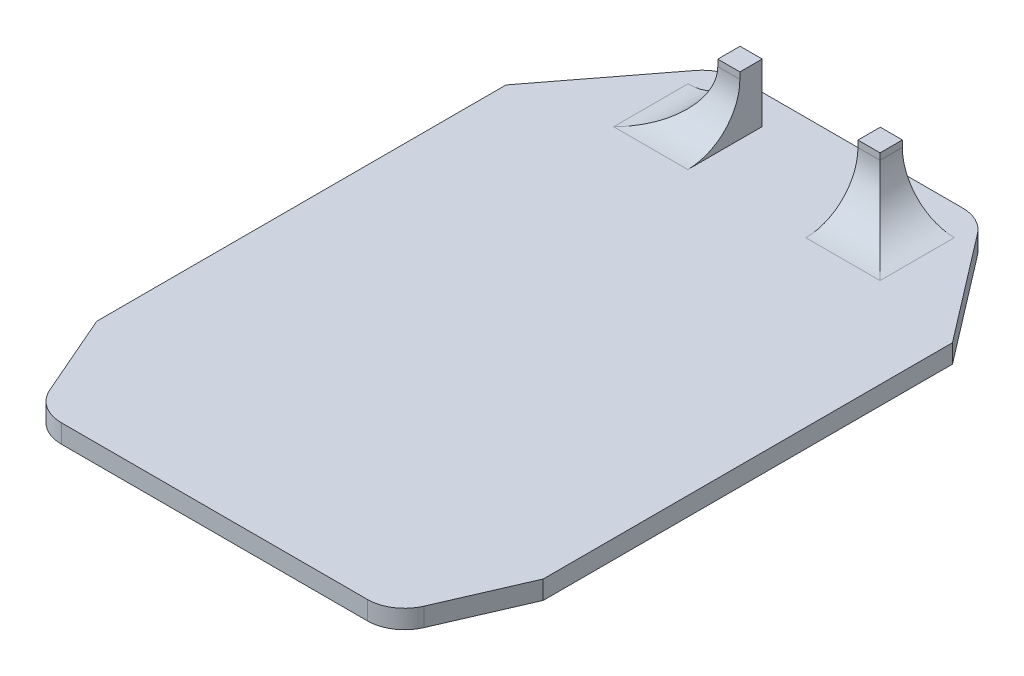
ISO-10303-21;
HEADER;
FILE_DESCRIPTION(('STEP AP214'),'2;1');
FILE_NAME('part.step','',(''),(''),'','','');
FILE_SCHEMA(('AUTOMOTIVE_DESIGN { 1 0 10303 214 1 1 1 1 }'));
ENDSEC;
DATA;
#1=APPLICATION_CONTEXT('core data for automotive mechanical design processes');
#2=APPLICATION_PROTOCOL_DEFINITION('international standard','automotive_design',2000,#1);
#3=PRODUCT_CONTEXT('',#1,'mechanical');
#4=PRODUCT('Part','Part','',(#3));
#5=PRODUCT_RELATED_PRODUCT_CATEGORY('part','',(#4));
#6=PRODUCT_DEFINITION_FORMATION('','',#4);
#7=PRODUCT_DEFINITION_CONTEXT('part definition',#1,'design');
#8=PRODUCT_DEFINITION('design','',#6,#7);
#9=PRODUCT_DEFINITION_SHAPE('','',#8);
#10=(LENGTH_UNIT() NAMED_UNIT(*) SI_UNIT(.MILLI.,.METRE.));
#11=(NAMED_UNIT(*) PLANE_ANGLE_UNIT() SI_UNIT($,.RADIAN.));
#12=(NAMED_UNIT(*) SI_UNIT($,.STERADIAN.) SOLID_ANGLE_UNIT());
#13=UNCERTAINTY_MEASURE_WITH_UNIT(LENGTH_MEASURE(1.E-05),#10,'distance_accuracy_value','');
#14=(GEOMETRIC_REPRESENTATION_CONTEXT(3) GLOBAL_UNCERTAINTY_ASSIGNED_CONTEXT((#13)) GLOBAL_UNIT_ASSIGNED_CONTEXT((#10,
#11,#12)) REPRESENTATION_CONTEXT('',''));
#15=CARTESIAN_POINT('',(0.,0.,0.));
#16=DIRECTION('',(0.,0.,1.));
#17=DIRECTION('',(1.,0.,0.));
#18=AXIS2_PLACEMENT_3D('',#15,#16,#17);
#19=CARTESIAN_POINT('',(0.,6.35,-141.121005256075));
#20=DIRECTION('',(0.,0.,-1.));
#21=DIRECTION('',(-1.,0.,0.));
#22=AXIS2_PLACEMENT_3D('',#19,#20,#21);
#23=PLANE('',#22);
#24=DIRECTION('',(1.,0.,0.));
#25=VECTOR('',#24,1.);
#26=CARTESIAN_POINT('',(0.,0.,-141.121005256075));
#27=LINE('',#26,#25);
#28=CARTESIAN_POINT('',(12.7,0.,-141.121005256075));
#29=VERTEX_POINT('',#28);
#30=CARTESIAN_POINT('',(88.9,0.,-141.121005256075));
#31=VERTEX_POINT('',#30);
#32=EDGE_CURVE('E221',#29,#31,#27,.T.);
#33=ORIENTED_EDGE('',*,*,#32,.F.);
#34=DIRECTION('',(0.,-1.,0.));
#35=VECTOR('',#34,1.);
#36=CARTESIAN_POINT('',(12.7,6.35,-141.121005256075));
#37=LINE('',#36,#35);
#38=CARTESIAN_POINT('',(12.7,6.35,-141.121005256075));
#39=VERTEX_POINT('',#38);
#40=EDGE_CURVE('E343',#39,#29,#37,.T.);
#41=ORIENTED_EDGE('',*,*,#40,.F.);
#42=DIRECTION('',(1.,0.,0.));
#43=VECTOR('',#42,1.);
#44=CARTESIAN_POINT('',(0.,6.35,-141.121005256075));
#45=LINE('',#44,#43);
#46=CARTESIAN_POINT('',(88.9,6.35,-141.121005256075));
#47=VERTEX_POINT('',#46);
#48=EDGE_CURVE('E259',#39,#47,#45,.T.);
#49=ORIENTED_EDGE('',*,*,#48,.T.);
#50=DIRECTION('',(0.,-1.,0.));
#51=VECTOR('',#50,1.);
#52=CARTESIAN_POINT('',(88.9,6.35,-141.121005256075));
#53=LINE('',#52,#51);
#54=EDGE_CURVE('E289',#47,#31,#53,.T.);
#55=ORIENTED_EDGE('',*,*,#54,.T.);
#56=EDGE_LOOP('',(#33,#41,#49,#55));
#57=FACE_BOUND('',#56,.T.);
#58=ADVANCED_FACE('F41',(#57),#23,.T.);
#59=CARTESIAN_POINT('',(12.7,6.35,-128.421005256075));
#60=DIRECTION('',(0.,-1.,0.));
#61=DIRECTION('',(0.,0.,-1.));
#62=AXIS2_PLACEMENT_3D('',#59,#60,#61);
#63=CYLINDRICAL_SURFACE('',#62,12.7);
#64=CARTESIAN_POINT('',(12.7,0.,-128.421005256075));
#65=DIRECTION('',(0.,1.,0.));
#66=DIRECTION('',(0.,0.,1.));
#67=AXIS2_PLACEMENT_3D('',#64,#65,#66);
#68=CIRCLE('',#67,12.7);
#69=CARTESIAN_POINT('',(2.61806803309445,0.,-136.144));
#70=VERTEX_POINT('',#69);
#71=EDGE_CURVE('E227',#29,#70,#68,.T.);
#72=ORIENTED_EDGE('',*,*,#71,.T.);
#73=DIRECTION('',(0.,-1.,0.));
#74=VECTOR('',#73,1.);
#75=CARTESIAN_POINT('',(2.61806803309445,6.35,-136.144));
#76=LINE('',#75,#74);
#77=CARTESIAN_POINT('',(2.61806803309445,6.35,-136.144));
#78=VERTEX_POINT('',#77);
#79=EDGE_CURVE('E341',#78,#70,#76,.T.);
#80=ORIENTED_EDGE('',*,*,#79,.F.);
#81=CARTESIAN_POINT('',(12.7,6.35,-128.421005256075));
#82=DIRECTION('',(0.,1.,0.));
#83=DIRECTION('',(0.,0.,1.));
#84=AXIS2_PLACEMENT_3D('',#81,#82,#83);
#85=CIRCLE('',#84,12.7);
#86=EDGE_CURVE('E265',#39,#78,#85,.T.);
#87=ORIENTED_EDGE('',*,*,#86,.F.);
#88=ORIENTED_EDGE('',*,*,#40,.T.);
#89=EDGE_LOOP('',(#72,#80,#87,#88));
#90=FACE_BOUND('',#89,.T.);
#91=ADVANCED_FACE('F416',(#90),#63,.T.);
#92=CARTESIAN_POINT('',(-64.0735694384663,6.35,-49.0818467752119));
#93=DIRECTION('',(0.793852910779963,0.,0.608109822356274));
#94=DIRECTION('',(0.608109822356274,0.,-0.793852910779964));
#95=AXIS2_PLACEMENT_3D('',#92,#93,#94);
#96=PLANE('',#95);
#97=DIRECTION('',(-0.608109822356274,0.,0.793852910779963));
#98=VECTOR('',#97,1.);
#99=CARTESIAN_POINT('',(-64.0735694384663,0.,-49.0818467752119));
#100=LINE('',#99,#98);
#101=CARTESIAN_POINT('',(-25.4,0.,-99.568));
#102=VERTEX_POINT('',#101);
#103=EDGE_CURVE('E291',#70,#102,#100,.T.);
#104=ORIENTED_EDGE('',*,*,#103,.T.);
#105=DIRECTION('',(0.,-1.,0.));
#106=VECTOR('',#105,1.);
#107=CARTESIAN_POINT('',(-25.4,6.35,-99.568));
#108=LINE('',#107,#106);
#109=CARTESIAN_POINT('',(-25.4,6.35,-99.568));
#110=VERTEX_POINT('',#109);
#111=EDGE_CURVE('E338',#110,#102,#108,.T.);
#112=ORIENTED_EDGE('',*,*,#111,.F.);
#113=DIRECTION('',(-0.608109822356274,0.,0.793852910779963));
#114=VECTOR('',#113,1.);
#115=CARTESIAN_POINT('',(-64.0735694384663,6.35,-49.0818467752119));
#116=LINE('',#115,#114);
#117=EDGE_CURVE('E264',#78,#110,#116,.T.);
#118=ORIENTED_EDGE('',*,*,#117,.F.);
#119=ORIENTED_EDGE('',*,*,#79,.T.);
#120=EDGE_LOOP('',(#104,#112,#118,#119));
#121=FACE_BOUND('',#120,.T.);
#122=ADVANCED_FACE('F421',(#121),#96,.F.);
#123=CARTESIAN_POINT('',(-25.4,6.35,0.));
#124=DIRECTION('',(-1.,0.,0.));
#125=DIRECTION('',(0.,0.,1.));
#126=AXIS2_PLACEMENT_3D('',#123,#124,#125);
#127=PLANE('',#126);
#128=DIRECTION('',(0.,0.,-1.));
#129=VECTOR('',#128,1.);
#130=CARTESIAN_POINT('',(-25.4,0.,0.));
#131=LINE('',#130,#129);
#132=CARTESIAN_POINT('',(-25.4,0.,40.132));
#133=VERTEX_POINT('',#132);
#134=EDGE_CURVE('E296',#133,#102,#131,.T.);
#135=ORIENTED_EDGE('',*,*,#134,.F.);
#136=DIRECTION('',(0.,-1.,0.));
#137=VECTOR('',#136,1.);
#138=CARTESIAN_POINT('',(-25.4,6.35,40.132));
#139=LINE('',#138,#137);
#140=CARTESIAN_POINT('',(-25.4,6.35,40.132));
#141=VERTEX_POINT('',#140);
#142=EDGE_CURVE('E337',#141,#133,#139,.T.);
#143=ORIENTED_EDGE('',*,*,#142,.F.);
#144=DIRECTION('',(0.,0.,-1.));
#145=VECTOR('',#144,1.);
#146=CARTESIAN_POINT('',(-25.4,6.35,0.));
#147=LINE('',#146,#145);
#148=EDGE_CURVE('E270',#141,#110,#147,.T.);
#149=ORIENTED_EDGE('',*,*,#148,.T.);
#150=ORIENTED_EDGE('',*,*,#111,.T.);
#151=EDGE_LOOP('',(#135,#143,#149,#150));
#152=FACE_BOUND('',#151,.T.);
#153=ADVANCED_FACE('F429',(#152),#127,.T.);
#154=CARTESIAN_POINT('',(-36.0281987162073,6.35,15.6242097463811));
#155=DIRECTION('',(-0.917444197261747,0.,0.397864480584468));
#156=DIRECTION('',(0.397864480584468,0.,0.917444197261747));
#157=AXIS2_PLACEMENT_3D('',#154,#155,#156);
#158=PLANE('',#157);
#159=DIRECTION('',(-0.397864480584468,0.,-0.917444197261747));
#160=VECTOR('',#159,1.);
#161=CARTESIAN_POINT('',(-36.0281987162073,0.,15.6242097463811));
#162=LINE('',#161,#160);
#163=CARTESIAN_POINT('',(-13.0748272468083,0.,68.5528789034228));
#164=VERTEX_POINT('',#163);
#165=EDGE_CURVE('E298',#164,#133,#162,.T.);
#166=ORIENTED_EDGE('',*,*,#165,.F.);
#167=DIRECTION('',(0.,-1.,0.));
#168=VECTOR('',#167,1.);
#169=CARTESIAN_POINT('',(-13.0748272468083,6.35,68.5528789034228));
#170=LINE('',#169,#168);
#171=CARTESIAN_POINT('',(-13.0748272468083,6.35,68.5528789034228));
#172=VERTEX_POINT('',#171);
#173=EDGE_CURVE('E333',#172,#164,#170,.T.);
#174=ORIENTED_EDGE('',*,*,#173,.F.);
#175=DIRECTION('',(-0.397864480584468,0.,-0.917444197261747));
#176=VECTOR('',#175,1.);
#177=CARTESIAN_POINT('',(-36.0281987162073,6.35,15.6242097463811));
#178=LINE('',#177,#176);
#179=EDGE_CURVE('E269',#172,#141,#178,.T.);
#180=ORIENTED_EDGE('',*,*,#179,.T.);
#181=ORIENTED_EDGE('',*,*,#142,.T.);
#182=EDGE_LOOP('',(#166,#174,#180,#181));
#183=FACE_BOUND('',#182,.T.);
#184=ADVANCED_FACE('F432',(#183),#158,.T.);
#185=CARTESIAN_POINT('',(-1.42328594158408,6.35,63.5));
#186=DIRECTION('',(0.,-1.,0.));
#187=DIRECTION('',(0.,0.,-1.));
#188=AXIS2_PLACEMENT_3D('',#185,#186,#187);
#189=CYLINDRICAL_SURFACE('',#188,12.7);
#190=CARTESIAN_POINT('',(-1.42328594158408,0.,63.5));
#191=DIRECTION('',(0.,1.,0.));
#192=DIRECTION('',(0.,0.,1.));
#193=AXIS2_PLACEMENT_3D('',#190,#191,#192);
#194=CIRCLE('',#193,12.7);
#195=CARTESIAN_POINT('',(-1.42328594158401,0.,76.2));
#196=VERTEX_POINT('',#195);
#197=EDGE_CURVE('E305',#196,#164,#194,.F.);
#198=ORIENTED_EDGE('',*,*,#197,.F.);
#199=DIRECTION('',(0.,-1.,0.));
#200=VECTOR('',#199,1.);
#201=CARTESIAN_POINT('',(-1.42328594158401,6.35,76.2));
#202=LINE('',#201,#200);
#203=CARTESIAN_POINT('',(-1.42328594158401,6.35,76.2));
#204=VERTEX_POINT('',#203);
#205=EDGE_CURVE('E334',#204,#196,#202,.T.);
#206=ORIENTED_EDGE('',*,*,#205,.F.);
#207=CARTESIAN_POINT('',(-1.42328594158408,6.35,63.5));
#208=DIRECTION('',(0.,1.,0.));
#209=DIRECTION('',(0.,0.,1.));
#210=AXIS2_PLACEMENT_3D('',#207,#208,#209);
#211=CIRCLE('',#210,12.7);
#212=EDGE_CURVE('E272',#204,#172,#211,.F.);
#213=ORIENTED_EDGE('',*,*,#212,.T.);
#214=ORIENTED_EDGE('',*,*,#173,.T.);
#215=EDGE_LOOP('',(#198,#206,#213,#214));
#216=FACE_BOUND('',#215,.T.);
#217=ADVANCED_FACE('F437',(#216),#189,.T.);
#218=CARTESIAN_POINT('',(0.,6.35,76.2));
#219=DIRECTION('',(0.,0.,1.));
#220=DIRECTION('',(1.,0.,0.));
#221=AXIS2_PLACEMENT_3D('',#218,#219,#220);
#222=PLANE('',#221);
#223=DIRECTION('',(-1.,0.,0.));
#224=VECTOR('',#223,1.);
#225=CARTESIAN_POINT('',(0.,0.,76.2));
#226=LINE('',#225,#224);
#227=CARTESIAN_POINT('',(103.023285941584,0.,76.2));
#228=VERTEX_POINT('',#227);
#229=EDGE_CURVE('E304',#228,#196,#226,.T.);
#230=ORIENTED_EDGE('',*,*,#229,.F.);
#231=DIRECTION('',(0.,-1.,0.));
#232=VECTOR('',#231,1.);
#233=CARTESIAN_POINT('',(103.023285941584,6.35,76.2));
#234=LINE('',#233,#232);
#235=CARTESIAN_POINT('',(103.023285941584,6.35,76.2));
#236=VERTEX_POINT('',#235);
#237=EDGE_CURVE('E332',#236,#228,#234,.T.);
#238=ORIENTED_EDGE('',*,*,#237,.F.);
#239=DIRECTION('',(-1.,0.,0.));
#240=VECTOR('',#239,1.);
#241=CARTESIAN_POINT('',(0.,6.35,76.2));
#242=LINE('',#241,#240);
#243=EDGE_CURVE('E277',#236,#204,#242,.T.);
#244=ORIENTED_EDGE('',*,*,#243,.T.);
#245=ORIENTED_EDGE('',*,*,#205,.T.);
#246=EDGE_LOOP('',(#230,#238,#244,#245));
#247=FACE_BOUND('',#246,.T.);
#248=ADVANCED_FACE('F445',(#247),#222,.T.);
#249=CARTESIAN_POINT('',(103.023285941584,6.35,63.5));
#250=DIRECTION('',(0.,-1.,0.));
#251=DIRECTION('',(0.,0.,-1.));
#252=AXIS2_PLACEMENT_3D('',#249,#250,#251);
#253=CYLINDRICAL_SURFACE('',#252,12.7);
#254=CARTESIAN_POINT('',(103.023285941584,0.,63.5));
#255=DIRECTION('',(0.,1.,0.));
#256=DIRECTION('',(0.,0.,1.));
#257=AXIS2_PLACEMENT_3D('',#254,#255,#256);
#258=CIRCLE('',#257,12.7);
#259=CARTESIAN_POINT('',(114.674827246808,0.,68.5528789034227));
#260=VERTEX_POINT('',#259);
#261=EDGE_CURVE('E306',#228,#260,#258,.T.);
#262=ORIENTED_EDGE('',*,*,#261,.T.);
#263=DIRECTION('',(0.,-1.,0.));
#264=VECTOR('',#263,1.);
#265=CARTESIAN_POINT('',(114.674827246808,6.35,68.5528789034227));
#266=LINE('',#265,#264);
#267=CARTESIAN_POINT('',(114.674827246808,6.35,68.5528789034227));
#268=VERTEX_POINT('',#267);
#269=EDGE_CURVE('E327',#268,#260,#266,.T.);
#270=ORIENTED_EDGE('',*,*,#269,.F.);
#271=CARTESIAN_POINT('',(103.023285941584,6.35,63.5));
#272=DIRECTION('',(0.,1.,0.));
#273=DIRECTION('',(0.,0.,1.));
#274=AXIS2_PLACEMENT_3D('',#271,#272,#273);
#275=CIRCLE('',#274,12.7);
#276=EDGE_CURVE('E276',#236,#268,#275,.T.);
#277=ORIENTED_EDGE('',*,*,#276,.F.);
#278=ORIENTED_EDGE('',*,*,#237,.T.);
#279=EDGE_LOOP('',(#262,#270,#277,#278));
#280=FACE_BOUND('',#279,.T.);
#281=ADVANCED_FACE('F446',(#280),#253,.T.);
#282=CARTESIAN_POINT('',(121.545310393275,6.35,52.710085181673));
#283=DIRECTION('',(-0.917444197261748,0.,-0.397864480584467));
#284=DIRECTION('',(-0.397864480584467,0.,0.917444197261748));
#285=AXIS2_PLACEMENT_3D('',#282,#283,#284);
#286=PLANE('',#285);
#287=DIRECTION('',(0.397864480584467,0.,-0.917444197261748));
#288=VECTOR('',#287,1.);
#289=CARTESIAN_POINT('',(121.545310393275,0.,52.710085181673));
#290=LINE('',#289,#288);
#291=CARTESIAN_POINT('',(127.,0.,40.132));
#292=VERTEX_POINT('',#291);
#293=EDGE_CURVE('E309',#260,#292,#290,.T.);
#294=ORIENTED_EDGE('',*,*,#293,.T.);
#295=DIRECTION('',(0.,-1.,0.));
#296=VECTOR('',#295,1.);
#297=CARTESIAN_POINT('',(127.,6.35,40.132));
#298=LINE('',#297,#296);
#299=CARTESIAN_POINT('',(127.,6.35,40.132));
#300=VERTEX_POINT('',#299);
#301=EDGE_CURVE('E324',#300,#292,#298,.T.);
#302=ORIENTED_EDGE('',*,*,#301,.F.);
#303=DIRECTION('',(0.397864480584467,0.,-0.917444197261748));
#304=VECTOR('',#303,1.);
#305=CARTESIAN_POINT('',(121.545310393275,6.35,52.710085181673));
#306=LINE('',#305,#304);
#307=EDGE_CURVE('E281',#268,#300,#306,.T.);
#308=ORIENTED_EDGE('',*,*,#307,.F.);
#309=ORIENTED_EDGE('',*,*,#269,.T.);
#310=EDGE_LOOP('',(#294,#302,#308,#309));
#311=FACE_BOUND('',#310,.T.);
#312=ADVANCED_FACE('F450',(#311),#286,.F.);
#313=CARTESIAN_POINT('',(127.,6.35,0.));
#314=DIRECTION('',(-1.,0.,0.));
#315=DIRECTION('',(0.,0.,1.));
#316=AXIS2_PLACEMENT_3D('',#313,#314,#315);
#317=PLANE('',#316);
#318=DIRECTION('',(0.,0.,-1.));
#319=VECTOR('',#318,1.);
#320=CARTESIAN_POINT('',(127.,0.,0.));
#321=LINE('',#320,#319);
#322=CARTESIAN_POINT('',(127.,0.,-99.568));
#323=VERTEX_POINT('',#322);
#324=EDGE_CURVE('E315',#292,#323,#321,.T.);
#325=ORIENTED_EDGE('',*,*,#324,.T.);
#326=DIRECTION('',(0.,-1.,0.));
#327=VECTOR('',#326,1.);
#328=CARTESIAN_POINT('',(127.,6.35,-99.568));
#329=LINE('',#328,#327);
#330=CARTESIAN_POINT('',(127.,6.35,-99.568));
#331=VERTEX_POINT('',#330);
#332=EDGE_CURVE('E323',#331,#323,#329,.T.);
#333=ORIENTED_EDGE('',*,*,#332,.F.);
#334=DIRECTION('',(0.,0.,-1.));
#335=VECTOR('',#334,1.);
#336=CARTESIAN_POINT('',(127.,6.35,0.));
#337=LINE('',#336,#335);
#338=EDGE_CURVE('E284',#300,#331,#337,.T.);
#339=ORIENTED_EDGE('',*,*,#338,.F.);
#340=ORIENTED_EDGE('',*,*,#301,.T.);
#341=EDGE_LOOP('',(#325,#333,#339,#340));
#342=FACE_BOUND('',#341,.T.);
#343=ADVANCED_FACE('F453',(#342),#317,.F.);
#344=CARTESIAN_POINT('',(128.102137744175,6.35,-98.1292216344357));
#345=DIRECTION('',(0.793852910779964,0.,-0.608109822356274));
#346=DIRECTION('',(-0.608109822356274,0.,-0.793852910779964));
#347=AXIS2_PLACEMENT_3D('',#344,#345,#346);
#348=PLANE('',#347);
#349=DIRECTION('',(0.608109822356274,0.,0.793852910779964));
#350=VECTOR('',#349,1.);
#351=CARTESIAN_POINT('',(128.102137744175,0.,-98.1292216344357));
#352=LINE('',#351,#350);
#353=CARTESIAN_POINT('',(98.9819319669055,0.,-136.144));
#354=VERTEX_POINT('',#353);
#355=EDGE_CURVE('E312',#354,#323,#352,.T.);
#356=ORIENTED_EDGE('',*,*,#355,.F.);
#357=DIRECTION('',(0.,-1.,0.));
#358=VECTOR('',#357,1.);
#359=CARTESIAN_POINT('',(98.9819319669055,6.35,-136.144));
#360=LINE('',#359,#358);
#361=CARTESIAN_POINT('',(98.9819319669055,6.35,-136.144));
#362=VERTEX_POINT('',#361);
#363=EDGE_CURVE('E321',#362,#354,#360,.T.);
#364=ORIENTED_EDGE('',*,*,#363,.F.);
#365=DIRECTION('',(0.608109822356274,0.,0.793852910779964));
#366=VECTOR('',#365,1.);
#367=CARTESIAN_POINT('',(128.102137744175,6.35,-98.1292216344357));
#368=LINE('',#367,#366);
#369=EDGE_CURVE('E285',#362,#331,#368,.T.);
#370=ORIENTED_EDGE('',*,*,#369,.T.);
#371=ORIENTED_EDGE('',*,*,#332,.T.);
#372=EDGE_LOOP('',(#356,#364,#370,#371));
#373=FACE_BOUND('',#372,.T.);
#374=ADVANCED_FACE('F456',(#373),#348,.T.);
#375=CARTESIAN_POINT('',(88.9,6.35,-128.421005256075));
#376=DIRECTION('',(0.,-1.,0.));
#377=DIRECTION('',(0.,0.,-1.));
#378=AXIS2_PLACEMENT_3D('',#375,#376,#377);
#379=CYLINDRICAL_SURFACE('',#378,12.7);
#380=CARTESIAN_POINT('',(88.9,0.,-128.421005256075));
#381=DIRECTION('',(0.,1.,0.));
#382=DIRECTION('',(0.,0.,1.));
#383=AXIS2_PLACEMENT_3D('',#380,#381,#382);
#384=CIRCLE('',#383,12.7);
#385=EDGE_CURVE('E263',#31,#354,#384,.F.);
#386=ORIENTED_EDGE('',*,*,#385,.F.);
#387=ORIENTED_EDGE('',*,*,#54,.F.);
#388=CARTESIAN_POINT('',(88.9,6.35,-128.421005256075));
#389=DIRECTION('',(0.,1.,0.));
#390=DIRECTION('',(0.,0.,1.));
#391=AXIS2_PLACEMENT_3D('',#388,#389,#390);
#392=CIRCLE('',#391,12.7);
#393=EDGE_CURVE('E287',#47,#362,#392,.F.);
#394=ORIENTED_EDGE('',*,*,#393,.T.);
#395=ORIENTED_EDGE('',*,*,#363,.T.);
#396=EDGE_LOOP('',(#386,#387,#394,#395));
#397=FACE_BOUND('',#396,.T.);
#398=ADVANCED_FACE('F462',(#397),#379,.T.);
#399=CARTESIAN_POINT('',(0.,6.35,0.));
#400=DIRECTION('',(0.,1.,0.));
#401=DIRECTION('',(0.,0.,1.));
#402=AXIS2_PLACEMENT_3D('',#399,#400,#401);
#403=PLANE('',#402);
#404=DIRECTION('',(0.,0.,-1.));
#405=VECTOR('',#404,1.);
#406=CARTESIAN_POINT('',(30.6451,6.35,-130.961005256075));
#407=LINE('',#406,#405);
#408=CARTESIAN_POINT('',(30.6451,6.35,-105.561005256075));
#409=VERTEX_POINT('',#408);
#410=CARTESIAN_POINT('',(30.6451,6.35,-130.961005256075));
#411=VERTEX_POINT('',#410);
#412=EDGE_CURVE('E253',#409,#411,#407,.T.);
#413=ORIENTED_EDGE('',*,*,#412,.F.);
#414=DIRECTION('',(1.,0.,0.));
#415=VECTOR('',#414,1.);
#416=CARTESIAN_POINT('',(0.,6.35,-105.561005256075));
#417=LINE('',#416,#415);
#418=CARTESIAN_POINT('',(5.32129999999998,6.35,-105.561005256075));
#419=VERTEX_POINT('',#418);
#420=EDGE_CURVE('E356',#409,#419,#417,.F.);
#421=ORIENTED_EDGE('',*,*,#420,.T.);
#422=DIRECTION('',(0.,0.,1.));
#423=VECTOR('',#422,1.);
#424=CARTESIAN_POINT('',(5.32129999999998,6.35,0.));
#425=LINE('',#424,#423);
#426=CARTESIAN_POINT('',(5.32129999999999,6.35,-130.961005256075));
#427=VERTEX_POINT('',#426);
#428=EDGE_CURVE('E354',#419,#427,#425,.F.);
#429=ORIENTED_EDGE('',*,*,#428,.T.);
#430=DIRECTION('',(-1.,0.,0.));
#431=VECTOR('',#430,1.);
#432=CARTESIAN_POINT('',(23.1013,6.35,-130.961005256075));
#433=LINE('',#432,#431);
#434=EDGE_CURVE('E218',#411,#427,#433,.T.);
#435=ORIENTED_EDGE('',*,*,#434,.F.);
#436=EDGE_LOOP('',(#413,#421,#429,#435));
#437=FACE_BOUND('',#436,.T.);
#438=DIRECTION('',(1.,0.,0.));
#439=VECTOR('',#438,1.);
#440=CARTESIAN_POINT('',(0.,6.35,-105.561005256075));
#441=LINE('',#440,#439);
#442=CARTESIAN_POINT('',(96.2787,6.35,-105.561005256075));
#443=VERTEX_POINT('',#442);
#444=CARTESIAN_POINT('',(70.9549,6.35,-105.561005256075));
#445=VERTEX_POINT('',#444);
#446=EDGE_CURVE('E348',#443,#445,#441,.F.);
#447=ORIENTED_EDGE('',*,*,#446,.T.);
#448=DIRECTION('',(0.,0.,1.));
#449=VECTOR('',#448,1.);
#450=CARTESIAN_POINT('',(70.9549,6.35,-130.961005256075));
#451=LINE('',#450,#449);
#452=CARTESIAN_POINT('',(70.9549,6.35,-130.961005256075));
#453=VERTEX_POINT('',#452);
#454=EDGE_CURVE('E245',#453,#445,#451,.T.);
#455=ORIENTED_EDGE('',*,*,#454,.F.);
#456=DIRECTION('',(-1.,0.,0.));
#457=VECTOR('',#456,1.);
#458=CARTESIAN_POINT('',(78.4987,6.35,-130.961005256075));
#459=LINE('',#458,#457);
#460=CARTESIAN_POINT('',(96.2787,6.35,-130.961005256075));
#461=VERTEX_POINT('',#460);
#462=EDGE_CURVE('E250',#461,#453,#459,.T.);
#463=ORIENTED_EDGE('',*,*,#462,.F.);
#464=DIRECTION('',(0.,0.,-1.));
#465=VECTOR('',#464,1.);
#466=CARTESIAN_POINT('',(96.2787,6.35,0.));
#467=LINE('',#466,#465);
#468=EDGE_CURVE('E346',#461,#443,#467,.F.);
#469=ORIENTED_EDGE('',*,*,#468,.T.);
#470=EDGE_LOOP('',(#447,#455,#463,#469));
#471=FACE_BOUND('',#470,.T.);
#472=ORIENTED_EDGE('',*,*,#48,.F.);
#473=ORIENTED_EDGE('',*,*,#86,.T.);
#474=ORIENTED_EDGE('',*,*,#117,.T.);
#475=ORIENTED_EDGE('',*,*,#148,.F.);
#476=ORIENTED_EDGE('',*,*,#179,.F.);
#477=ORIENTED_EDGE('',*,*,#212,.F.);
#478=ORIENTED_EDGE('',*,*,#243,.F.);
#479=ORIENTED_EDGE('',*,*,#276,.T.);
#480=ORIENTED_EDGE('',*,*,#307,.T.);
#481=ORIENTED_EDGE('',*,*,#338,.T.);
#482=ORIENTED_EDGE('',*,*,#369,.F.);
#483=ORIENTED_EDGE('',*,*,#393,.F.);
#484=EDGE_LOOP('',(#472,#473,#474,#475,#476,#477,#478,#479,#480,#481,#482,#483));
#485=FACE_BOUND('',#484,.T.);
#486=ADVANCED_FACE('F402',(#437,#471,#485),#403,.T.);
#487=CARTESIAN_POINT('',(0.,0.,0.));
#488=DIRECTION('',(0.,1.,0.));
#489=DIRECTION('',(0.,0.,1.));
#490=AXIS2_PLACEMENT_3D('',#487,#488,#489);
#491=PLANE('',#490);
#492=ORIENTED_EDGE('',*,*,#32,.T.);
#493=ORIENTED_EDGE('',*,*,#385,.T.);
#494=ORIENTED_EDGE('',*,*,#355,.T.);
#495=ORIENTED_EDGE('',*,*,#324,.F.);
#496=ORIENTED_EDGE('',*,*,#293,.F.);
#497=ORIENTED_EDGE('',*,*,#261,.F.);
#498=ORIENTED_EDGE('',*,*,#229,.T.);
#499=ORIENTED_EDGE('',*,*,#197,.T.);
#500=ORIENTED_EDGE('',*,*,#165,.T.);
#501=ORIENTED_EDGE('',*,*,#134,.T.);
#502=ORIENTED_EDGE('',*,*,#103,.F.);
#503=ORIENTED_EDGE('',*,*,#71,.F.);
#504=EDGE_LOOP('',(#492,#493,#494,#495,#496,#497,#498,#499,#500,#501,#502,#503));
#505=FACE_BOUND('',#504,.T.);
#506=ADVANCED_FACE('F470',(#505),#491,.F.);
#507=CARTESIAN_POINT('',(78.4987,26.3398,-130.961005256075));
#508=DIRECTION('',(-1.,0.,0.));
#509=DIRECTION('',(0.,0.,1.));
#510=AXIS2_PLACEMENT_3D('',#507,#508,#509);
#511=PLANE('',#510);
#512=DIRECTION('',(0.,-1.,0.));
#513=VECTOR('',#512,1.);
#514=CARTESIAN_POINT('',(78.4987,26.3398,-123.341005256075));
#515=LINE('',#514,#513);
#516=CARTESIAN_POINT('',(78.4987,26.3398,-123.341005256075));
#517=VERTEX_POINT('',#516);
#518=CARTESIAN_POINT('',(78.4987,24.13,-123.341005256075));
#519=VERTEX_POINT('',#518);
#520=EDGE_CURVE('E242',#517,#519,#515,.T.);
#521=ORIENTED_EDGE('',*,*,#520,.T.);
#522=DIRECTION('',(0.,0.,-1.));
#523=VECTOR('',#522,1.);
#524=CARTESIAN_POINT('',(78.4987,24.13,-130.961005256075));
#525=LINE('',#524,#523);
#526=CARTESIAN_POINT('',(78.4987,24.13,-130.961005256075));
#527=VERTEX_POINT('',#526);
#528=EDGE_CURVE('E59',#519,#527,#525,.T.);
#529=ORIENTED_EDGE('',*,*,#528,.T.);
#530=DIRECTION('',(0.,-1.,0.));
#531=VECTOR('',#530,1.);
#532=CARTESIAN_POINT('',(78.4987,26.3398,-130.961005256075));
#533=LINE('',#532,#531);
#534=CARTESIAN_POINT('',(78.4987,26.3398,-130.961005256075));
#535=VERTEX_POINT('',#534);
#536=EDGE_CURVE('E232',#535,#527,#533,.T.);
#537=ORIENTED_EDGE('',*,*,#536,.F.);
#538=DIRECTION('',(0.,0.,-1.));
#539=VECTOR('',#538,1.);
#540=CARTESIAN_POINT('',(78.4987,26.3398,-130.961005256075));
#541=LINE('',#540,#539);
#542=EDGE_CURVE('E247',#517,#535,#541,.T.);
#543=ORIENTED_EDGE('',*,*,#542,.F.);
#544=EDGE_LOOP('',(#521,#529,#537,#543));
#545=FACE_BOUND('',#544,.T.);
#546=ADVANCED_FACE('F469',(#545),#511,.F.);
#547=CARTESIAN_POINT('',(78.4987,26.3398,-130.961005256075));
#548=DIRECTION('',(0.,0.,1.));
#549=DIRECTION('',(1.,0.,0.));
#550=AXIS2_PLACEMENT_3D('',#547,#548,#549);
#551=PLANE('',#550);
#552=CARTESIAN_POINT('',(75.2983,21.3614,-130.961005256075));
#553=DIRECTION('',(0.,0.,-1.));
#554=DIRECTION('',(-1.,0.,0.));
#555=AXIS2_PLACEMENT_3D('',#552,#553,#554);
#556=CIRCLE('',#555,1.3462);
#557=CARTESIAN_POINT('',(73.9521,21.3614,-130.961005256075));
#558=VERTEX_POINT('',#557);
#559=EDGE_CURVE('E382',#558,#558,#556,.T.);
#560=ORIENTED_EDGE('',*,*,#559,.F.);
#561=EDGE_LOOP('',(#560));
#562=FACE_BOUND('',#561,.T.);
#563=CARTESIAN_POINT('',(75.2983,11.3538,-130.961005256075));
#564=DIRECTION('',(0.,0.,-1.));
#565=DIRECTION('',(-1.,0.,0.));
#566=AXIS2_PLACEMENT_3D('',#563,#564,#565);
#567=CIRCLE('',#566,1.3462);
#568=CARTESIAN_POINT('',(73.9521,11.3538,-130.961005256075));
#569=VERTEX_POINT('',#568);
#570=EDGE_CURVE('E378',#569,#569,#567,.T.);
#571=ORIENTED_EDGE('',*,*,#570,.F.);
#572=EDGE_LOOP('',(#571));
#573=FACE_BOUND('',#572,.T.);
#574=ORIENTED_EDGE('',*,*,#462,.T.);
#575=DIRECTION('',(0.,-1.,0.));
#576=VECTOR('',#575,1.);
#577=CARTESIAN_POINT('',(70.9549,26.3398,-130.961005256075));
#578=LINE('',#577,#576);
#579=CARTESIAN_POINT('',(70.9549,26.3398,-130.961005256075));
#580=VERTEX_POINT('',#579);
#581=EDGE_CURVE('E234',#580,#453,#578,.T.);
#582=ORIENTED_EDGE('',*,*,#581,.F.);
#583=DIRECTION('',(-1.,0.,0.));
#584=VECTOR('',#583,1.);
#585=CARTESIAN_POINT('',(78.4987,26.3398,-130.961005256075));
#586=LINE('',#585,#584);
#587=EDGE_CURVE('E254',#535,#580,#586,.T.);
#588=ORIENTED_EDGE('',*,*,#587,.F.);
#589=ORIENTED_EDGE('',*,*,#536,.T.);
#590=CARTESIAN_POINT('',(96.2787,24.13,-130.961005256075));
#591=DIRECTION('',(0.,0.,1.));
#592=DIRECTION('',(1.,0.,0.));
#593=AXIS2_PLACEMENT_3D('',#590,#591,#592);
#594=CIRCLE('',#593,17.78);
#595=EDGE_CURVE('E11',#527,#461,#594,.T.);
#596=ORIENTED_EDGE('',*,*,#595,.T.);
#597=EDGE_LOOP('',(#574,#582,#588,#589,#596));
#598=FACE_BOUND('',#597,.T.);
#599=ADVANCED_FACE('F484',(#562,#573,#598),#551,.F.);
#600=CARTESIAN_POINT('',(70.9549,26.3398,-130.961005256075));
#601=DIRECTION('',(1.,0.,0.));
#602=DIRECTION('',(0.,0.,-1.));
#603=AXIS2_PLACEMENT_3D('',#600,#601,#602);
#604=PLANE('',#603);
#605=ORIENTED_EDGE('',*,*,#454,.T.);
#606=CARTESIAN_POINT('',(70.9549,24.13,-105.561005256075));
#607=DIRECTION('',(1.,0.,0.));
#608=DIRECTION('',(0.,0.,-1.));
#609=AXIS2_PLACEMENT_3D('',#606,#607,#608);
#610=CIRCLE('',#609,17.78);
#611=CARTESIAN_POINT('',(70.9549,24.13,-123.341005256075));
#612=VERTEX_POINT('',#611);
#613=EDGE_CURVE('E368',#445,#612,#610,.T.);
#614=ORIENTED_EDGE('',*,*,#613,.T.);
#615=DIRECTION('',(0.,-1.,0.));
#616=VECTOR('',#615,1.);
#617=CARTESIAN_POINT('',(70.9549,26.3398,-123.341005256075));
#618=LINE('',#617,#616);
#619=CARTESIAN_POINT('',(70.9549,26.3398,-123.341005256075));
#620=VERTEX_POINT('',#619);
#621=EDGE_CURVE('E239',#620,#612,#618,.T.);
#622=ORIENTED_EDGE('',*,*,#621,.F.);
#623=DIRECTION('',(0.,0.,1.));
#624=VECTOR('',#623,1.);
#625=CARTESIAN_POINT('',(70.9549,26.3398,-130.961005256075));
#626=LINE('',#625,#624);
#627=EDGE_CURVE('E251',#580,#620,#626,.T.);
#628=ORIENTED_EDGE('',*,*,#627,.F.);
#629=ORIENTED_EDGE('',*,*,#581,.T.);
#630=EDGE_LOOP('',(#605,#614,#622,#628,#629));
#631=FACE_BOUND('',#630,.T.);
#632=ADVANCED_FACE('F481',(#631),#604,.F.);
#633=CARTESIAN_POINT('',(78.4987,26.3398,-123.341005256075));
#634=DIRECTION('',(0.,0.,-1.));
#635=DIRECTION('',(-1.,0.,0.));
#636=AXIS2_PLACEMENT_3D('',#633,#634,#635);
#637=PLANE('',#636);
#638=ORIENTED_EDGE('',*,*,#621,.T.);
#639=DIRECTION('',(1.,0.,0.));
#640=VECTOR('',#639,1.);
#641=CARTESIAN_POINT('',(78.4987,24.13,-123.341005256075));
#642=LINE('',#641,#640);
#643=EDGE_CURVE('E357',#612,#519,#642,.T.);
#644=ORIENTED_EDGE('',*,*,#643,.T.);
#645=ORIENTED_EDGE('',*,*,#520,.F.);
#646=DIRECTION('',(1.,0.,0.));
#647=VECTOR('',#646,1.);
#648=CARTESIAN_POINT('',(78.4987,26.3398,-123.341005256075));
#649=LINE('',#648,#647);
#650=EDGE_CURVE('E243',#620,#517,#649,.T.);
#651=ORIENTED_EDGE('',*,*,#650,.F.);
#652=EDGE_LOOP('',(#638,#644,#645,#651));
#653=FACE_BOUND('',#652,.T.);
#654=ADVANCED_FACE('F480',(#653),#637,.F.);
#655=CARTESIAN_POINT('',(0.,26.3398,0.));
#656=DIRECTION('',(0.,-1.,0.));
#657=DIRECTION('',(0.,0.,-1.));
#658=AXIS2_PLACEMENT_3D('',#655,#656,#657);
#659=PLANE('',#658);
#660=ORIENTED_EDGE('',*,*,#542,.T.);
#661=ORIENTED_EDGE('',*,*,#587,.T.);
#662=ORIENTED_EDGE('',*,*,#627,.T.);
#663=ORIENTED_EDGE('',*,*,#650,.T.);
#664=EDGE_LOOP('',(#660,#661,#662,#663));
#665=FACE_BOUND('',#664,.T.);
#666=ADVANCED_FACE('F475',(#665),#659,.F.);
#667=CARTESIAN_POINT('',(23.1013,26.3398,-130.961005256075));
#668=DIRECTION('',(1.,0.,0.));
#669=DIRECTION('',(0.,0.,-1.));
#670=AXIS2_PLACEMENT_3D('',#667,#668,#669);
#671=PLANE('',#670);
#672=DIRECTION('',(0.,-1.,0.));
#673=VECTOR('',#672,1.);
#674=CARTESIAN_POINT('',(23.1013,26.3398,-130.961005256075));
#675=LINE('',#674,#673);
#676=CARTESIAN_POINT('',(23.1013,26.3398,-130.961005256075));
#677=VERTEX_POINT('',#676);
#678=CARTESIAN_POINT('',(23.1013,24.13,-130.961005256075));
#679=VERTEX_POINT('',#678);
#680=EDGE_CURVE('E391',#677,#679,#675,.T.);
#681=ORIENTED_EDGE('',*,*,#680,.T.);
#682=DIRECTION('',(0.,0.,1.));
#683=VECTOR('',#682,1.);
#684=CARTESIAN_POINT('',(23.1013,24.13,-130.961005256075));
#685=LINE('',#684,#683);
#686=CARTESIAN_POINT('',(23.1013,24.13,-123.341005256075));
#687=VERTEX_POINT('',#686);
#688=EDGE_CURVE('E224',#679,#687,#685,.T.);
#689=ORIENTED_EDGE('',*,*,#688,.T.);
#690=DIRECTION('',(0.,-1.,0.));
#691=VECTOR('',#690,1.);
#692=CARTESIAN_POINT('',(23.1013,26.3398,-123.341005256075));
#693=LINE('',#692,#691);
#694=CARTESIAN_POINT('',(23.1013,26.3398,-123.341005256075));
#695=VERTEX_POINT('',#694);
#696=EDGE_CURVE('E202',#695,#687,#693,.T.);
#697=ORIENTED_EDGE('',*,*,#696,.F.);
#698=DIRECTION('',(0.,0.,1.));
#699=VECTOR('',#698,1.);
#700=CARTESIAN_POINT('',(23.1013,26.3398,-130.961005256075));
#701=LINE('',#700,#699);
#702=EDGE_CURVE('E215',#677,#695,#701,.T.);
#703=ORIENTED_EDGE('',*,*,#702,.F.);
#704=EDGE_LOOP('',(#681,#689,#697,#703));
#705=FACE_BOUND('',#704,.T.);
#706=ADVANCED_FACE('F222',(#705),#671,.F.);
#707=CARTESIAN_POINT('',(23.1013,26.3398,-123.341005256075));
#708=DIRECTION('',(0.,0.,-1.));
#709=DIRECTION('',(-1.,0.,0.));
#710=AXIS2_PLACEMENT_3D('',#707,#708,#709);
#711=PLANE('',#710);
#712=ORIENTED_EDGE('',*,*,#696,.T.);
#713=DIRECTION('',(1.,0.,0.));
#714=VECTOR('',#713,1.);
#715=CARTESIAN_POINT('',(23.1013,24.13,-123.341005256075));
#716=LINE('',#715,#714);
#717=CARTESIAN_POINT('',(30.6451,24.13,-123.341005256075));
#718=VERTEX_POINT('',#717);
#719=EDGE_CURVE('E347',#687,#718,#716,.T.);
#720=ORIENTED_EDGE('',*,*,#719,.T.);
#721=DIRECTION('',(0.,-1.,0.));
#722=VECTOR('',#721,1.);
#723=CARTESIAN_POINT('',(30.6451,26.3398,-123.341005256075));
#724=LINE('',#723,#722);
#725=CARTESIAN_POINT('',(30.6451,26.3398,-123.341005256075));
#726=VERTEX_POINT('',#725);
#727=EDGE_CURVE('E208',#726,#718,#724,.T.);
#728=ORIENTED_EDGE('',*,*,#727,.F.);
#729=DIRECTION('',(1.,0.,0.));
#730=VECTOR('',#729,1.);
#731=CARTESIAN_POINT('',(23.1013,26.3398,-123.341005256075));
#732=LINE('',#731,#730);
#733=EDGE_CURVE('E199',#695,#726,#732,.T.);
#734=ORIENTED_EDGE('',*,*,#733,.F.);
#735=EDGE_LOOP('',(#712,#720,#728,#734));
#736=FACE_BOUND('',#735,.T.);
#737=ADVANCED_FACE('F205',(#736),#711,.F.);
#738=CARTESIAN_POINT('',(30.6451,26.3398,-130.961005256075));
#739=DIRECTION('',(-1.,0.,0.));
#740=DIRECTION('',(0.,0.,1.));
#741=AXIS2_PLACEMENT_3D('',#738,#739,#740);
#742=PLANE('',#741);
#743=ORIENTED_EDGE('',*,*,#412,.T.);
#744=DIRECTION('',(0.,-1.,0.));
#745=VECTOR('',#744,1.);
#746=CARTESIAN_POINT('',(30.6451,26.3398,-130.961005256075));
#747=LINE('',#746,#745);
#748=CARTESIAN_POINT('',(30.6451,26.3398,-130.961005256075));
#749=VERTEX_POINT('',#748);
#750=EDGE_CURVE('E228',#749,#411,#747,.T.);
#751=ORIENTED_EDGE('',*,*,#750,.F.);
#752=DIRECTION('',(0.,0.,-1.));
#753=VECTOR('',#752,1.);
#754=CARTESIAN_POINT('',(30.6451,26.3398,-130.961005256075));
#755=LINE('',#754,#753);
#756=EDGE_CURVE('E211',#726,#749,#755,.T.);
#757=ORIENTED_EDGE('',*,*,#756,.F.);
#758=ORIENTED_EDGE('',*,*,#727,.T.);
#759=CARTESIAN_POINT('',(30.6451,24.13,-105.561005256075));
#760=DIRECTION('',(-1.,0.,0.));
#761=DIRECTION('',(0.,0.,1.));
#762=AXIS2_PLACEMENT_3D('',#759,#760,#761);
#763=CIRCLE('',#762,17.78);
#764=EDGE_CURVE('E361',#718,#409,#763,.T.);
#765=ORIENTED_EDGE('',*,*,#764,.T.);
#766=EDGE_LOOP('',(#743,#751,#757,#758,#765));
#767=FACE_BOUND('',#766,.T.);
#768=ADVANCED_FACE('F398',(#767),#742,.F.);
#769=CARTESIAN_POINT('',(23.1013,26.3398,-130.961005256075));
#770=DIRECTION('',(0.,0.,1.));
#771=DIRECTION('',(1.,0.,0.));
#772=AXIS2_PLACEMENT_3D('',#769,#770,#771);
#773=PLANE('',#772);
#774=CARTESIAN_POINT('',(26.3017,11.3538,-130.961005256075));
#775=DIRECTION('',(0.,0.,-1.));
#776=DIRECTION('',(1.,0.,0.));
#777=AXIS2_PLACEMENT_3D('',#774,#775,#776);
#778=CIRCLE('',#777,1.3462);
#779=CARTESIAN_POINT('',(27.6479,11.3538,-130.961005256075));
#780=VERTEX_POINT('',#779);
#781=EDGE_CURVE('E546',#780,#780,#778,.T.);
#782=ORIENTED_EDGE('',*,*,#781,.F.);
#783=EDGE_LOOP('',(#782));
#784=FACE_BOUND('',#783,.T.);
#785=CARTESIAN_POINT('',(26.3017,21.3614,-130.961005256075));
#786=DIRECTION('',(0.,0.,-1.));
#787=DIRECTION('',(1.,0.,0.));
#788=AXIS2_PLACEMENT_3D('',#785,#786,#787);
#789=CIRCLE('',#788,1.3462);
#790=CARTESIAN_POINT('',(27.6479,21.3614,-130.961005256075));
#791=VERTEX_POINT('',#790);
#792=EDGE_CURVE('E545',#791,#791,#789,.T.);
#793=ORIENTED_EDGE('',*,*,#792,.F.);
#794=EDGE_LOOP('',(#793));
#795=FACE_BOUND('',#794,.T.);
#796=ORIENTED_EDGE('',*,*,#434,.T.);
#797=CARTESIAN_POINT('',(5.32129999999998,24.13,-130.961005256075));
#798=DIRECTION('',(0.,0.,1.));
#799=DIRECTION('',(1.,0.,0.));
#800=AXIS2_PLACEMENT_3D('',#797,#798,#799);
#801=CIRCLE('',#800,17.78);
#802=EDGE_CURVE('E49',#427,#679,#801,.T.);
#803=ORIENTED_EDGE('',*,*,#802,.T.);
#804=ORIENTED_EDGE('',*,*,#680,.F.);
#805=DIRECTION('',(-1.,0.,0.));
#806=VECTOR('',#805,1.);
#807=CARTESIAN_POINT('',(23.1013,26.3398,-130.961005256075));
#808=LINE('',#807,#806);
#809=EDGE_CURVE('E220',#749,#677,#808,.T.);
#810=ORIENTED_EDGE('',*,*,#809,.F.);
#811=ORIENTED_EDGE('',*,*,#750,.T.);
#812=EDGE_LOOP('',(#796,#803,#804,#810,#811));
#813=FACE_BOUND('',#812,.T.);
#814=ADVANCED_FACE('F400',(#784,#795,#813),#773,.F.);
#815=CARTESIAN_POINT('',(0.,26.3398,0.));
#816=DIRECTION('',(0.,1.,0.));
#817=DIRECTION('',(0.,0.,1.));
#818=AXIS2_PLACEMENT_3D('',#815,#816,#817);
#819=PLANE('',#818);
#820=ORIENTED_EDGE('',*,*,#702,.T.);
#821=ORIENTED_EDGE('',*,*,#733,.T.);
#822=ORIENTED_EDGE('',*,*,#756,.T.);
#823=ORIENTED_EDGE('',*,*,#809,.T.);
#824=EDGE_LOOP('',(#820,#821,#822,#823));
#825=FACE_BOUND('',#824,.T.);
#826=ADVANCED_FACE('F214',(#825),#819,.T.);
#827=CARTESIAN_POINT('',(5.32129999999998,24.13,-130.961005256075));
#828=DIRECTION('',(0.,0.,1.));
#829=DIRECTION('',(1.,0.,0.));
#830=AXIS2_PLACEMENT_3D('',#827,#828,#829);
#831=CYLINDRICAL_SURFACE('',#830,17.78);
#832=ORIENTED_EDGE('',*,*,#802,.F.);
#833=ORIENTED_EDGE('',*,*,#428,.F.);
#834=CARTESIAN_POINT('',(5.32129999999998,24.13,-105.561005256075));
#835=DIRECTION('',(0.707106781186547,0.,0.707106781186547));
#836=DIRECTION('',(-0.707106781186547,0.,0.707106781186547));
#837=AXIS2_PLACEMENT_3D('',#834,#835,#836);
#838=ELLIPSE('',#837,25.1447171389936,17.78);
#839=EDGE_CURVE('E237',#687,#419,#838,.F.);
#840=ORIENTED_EDGE('',*,*,#839,.F.);
#841=ORIENTED_EDGE('',*,*,#688,.F.);
#842=EDGE_LOOP('',(#832,#833,#840,#841));
#843=FACE_BOUND('',#842,.T.);
#844=ADVANCED_FACE('F403',(#843),#831,.F.);
#845=CARTESIAN_POINT('',(23.1013,24.13,-105.561005256075));
#846=DIRECTION('',(1.,0.,0.));
#847=DIRECTION('',(0.,0.,-1.));
#848=AXIS2_PLACEMENT_3D('',#845,#846,#847);
#849=CYLINDRICAL_SURFACE('',#848,17.78);
#850=ORIENTED_EDGE('',*,*,#839,.T.);
#851=ORIENTED_EDGE('',*,*,#420,.F.);
#852=ORIENTED_EDGE('',*,*,#764,.F.);
#853=ORIENTED_EDGE('',*,*,#719,.F.);
#854=EDGE_LOOP('',(#850,#851,#852,#853));
#855=FACE_BOUND('',#854,.T.);
#856=ADVANCED_FACE('F406',(#855),#849,.F.);
#857=CARTESIAN_POINT('',(96.2787,24.13,-130.961005256075));
#858=DIRECTION('',(0.,0.,-1.));
#859=DIRECTION('',(-1.,0.,0.));
#860=AXIS2_PLACEMENT_3D('',#857,#858,#859);
#861=CYLINDRICAL_SURFACE('',#860,17.78);
#862=ORIENTED_EDGE('',*,*,#595,.F.);
#863=ORIENTED_EDGE('',*,*,#528,.F.);
#864=CARTESIAN_POINT('',(96.2787,24.13,-105.561005256075));
#865=DIRECTION('',(0.707106781186547,0.,-0.707106781186547));
#866=DIRECTION('',(-0.707106781186547,0.,-0.707106781186547));
#867=AXIS2_PLACEMENT_3D('',#864,#865,#866);
#868=ELLIPSE('',#867,25.1447171389936,17.78);
#869=EDGE_CURVE('E44',#443,#519,#868,.T.);
#870=ORIENTED_EDGE('',*,*,#869,.F.);
#871=ORIENTED_EDGE('',*,*,#468,.F.);
#872=EDGE_LOOP('',(#862,#863,#870,#871));
#873=FACE_BOUND('',#872,.T.);
#874=ADVANCED_FACE('F43',(#873),#861,.F.);
#875=CARTESIAN_POINT('',(78.4987,24.13,-105.561005256075));
#876=DIRECTION('',(1.,0.,0.));
#877=DIRECTION('',(0.,0.,-1.));
#878=AXIS2_PLACEMENT_3D('',#875,#876,#877);
#879=CYLINDRICAL_SURFACE('',#878,17.78);
#880=ORIENTED_EDGE('',*,*,#613,.F.);
#881=ORIENTED_EDGE('',*,*,#446,.F.);
#882=ORIENTED_EDGE('',*,*,#869,.T.);
#883=ORIENTED_EDGE('',*,*,#643,.F.);
#884=EDGE_LOOP('',(#880,#881,#882,#883));
#885=FACE_BOUND('',#884,.T.);
#886=ADVANCED_FACE('F412',(#885),#879,.F.);
#887=CARTESIAN_POINT('',(26.3017,21.3614,-125.550805256075));
#888=DIRECTION('',(0.,0.,-1.));
#889=DIRECTION('',(-1.,0.,0.));
#890=AXIS2_PLACEMENT_3D('',#887,#888,#889);
#891=CYLINDRICAL_SURFACE('',#890,1.3462);
#892=CARTESIAN_POINT('',(26.3017,21.3614,-125.550805256075));
#893=DIRECTION('',(0.,0.,-1.));
#894=DIRECTION('',(1.,0.,0.));
#895=AXIS2_PLACEMENT_3D('',#892,#893,#894);
#896=CIRCLE('',#895,1.3462);
#897=CARTESIAN_POINT('',(27.6479,21.3614,-125.550805256075));
#898=VERTEX_POINT('',#897);
#899=EDGE_CURVE('E537',#898,#898,#896,.T.);
#900=ORIENTED_EDGE('',*,*,#899,.F.);
#901=EDGE_LOOP('',(#900));
#902=FACE_BOUND('',#901,.T.);
#903=ORIENTED_EDGE('',*,*,#792,.T.);
#904=EDGE_LOOP('',(#903));
#905=FACE_BOUND('',#904,.T.);
#906=ADVANCED_FACE('F530',(#902,#905),#891,.F.);
#907=CARTESIAN_POINT('',(26.3017,21.3614,-125.550805256075));
#908=DIRECTION('',(0.,0.,1.));
#909=DIRECTION('',(1.,0.,0.));
#910=AXIS2_PLACEMENT_3D('',#907,#908,#909);
#911=PLANE('',#910);
#912=ORIENTED_EDGE('',*,*,#899,.T.);
#913=EDGE_LOOP('',(#912));
#914=FACE_BOUND('',#913,.T.);
#915=ADVANCED_FACE('F519',(#914),#911,.F.);
#916=CARTESIAN_POINT('',(26.3017,11.3538,-125.550805256075));
#917=DIRECTION('',(0.,0.,-1.));
#918=DIRECTION('',(-1.,0.,0.));
#919=AXIS2_PLACEMENT_3D('',#916,#917,#918);
#920=CYLINDRICAL_SURFACE('',#919,1.3462);
#921=CARTESIAN_POINT('',(26.3017,11.3538,-125.550805256075));
#922=DIRECTION('',(0.,0.,-1.));
#923=DIRECTION('',(1.,0.,0.));
#924=AXIS2_PLACEMENT_3D('',#921,#922,#923);
#925=CIRCLE('',#924,1.3462);
#926=CARTESIAN_POINT('',(27.6479,11.3538,-125.550805256075));
#927=VERTEX_POINT('',#926);
#928=EDGE_CURVE('E387',#927,#927,#925,.T.);
#929=ORIENTED_EDGE('',*,*,#928,.F.);
#930=EDGE_LOOP('',(#929));
#931=FACE_BOUND('',#930,.T.);
#932=ORIENTED_EDGE('',*,*,#781,.T.);
#933=EDGE_LOOP('',(#932));
#934=FACE_BOUND('',#933,.T.);
#935=ADVANCED_FACE('F514',(#931,#934),#920,.F.);
#936=CARTESIAN_POINT('',(26.3017,11.3538,-125.550805256075));
#937=DIRECTION('',(0.,0.,1.));
#938=DIRECTION('',(1.,0.,0.));
#939=AXIS2_PLACEMENT_3D('',#936,#937,#938);
#940=PLANE('',#939);
#941=ORIENTED_EDGE('',*,*,#928,.T.);
#942=EDGE_LOOP('',(#941));
#943=FACE_BOUND('',#942,.T.);
#944=ADVANCED_FACE('F510',(#943),#940,.F.);
#945=CARTESIAN_POINT('',(75.2983,11.3538,-125.550805256075));
#946=DIRECTION('',(0.,0.,-1.));
#947=DIRECTION('',(-1.,0.,0.));
#948=AXIS2_PLACEMENT_3D('',#945,#946,#947);
#949=CYLINDRICAL_SURFACE('',#948,1.3462);
#950=CARTESIAN_POINT('',(75.2983,11.3538,-125.550805256075));
#951=DIRECTION('',(0.,0.,-1.));
#952=DIRECTION('',(-1.,0.,0.));
#953=AXIS2_PLACEMENT_3D('',#950,#951,#952);
#954=CIRCLE('',#953,1.3462);
#955=CARTESIAN_POINT('',(73.9521,11.3538,-125.550805256075));
#956=VERTEX_POINT('',#955);
#957=EDGE_CURVE('E375',#956,#956,#954,.T.);
#958=ORIENTED_EDGE('',*,*,#957,.F.);
#959=EDGE_LOOP('',(#958));
#960=FACE_BOUND('',#959,.T.);
#961=ORIENTED_EDGE('',*,*,#570,.T.);
#962=EDGE_LOOP('',(#961));
#963=FACE_BOUND('',#962,.T.);
#964=ADVANCED_FACE('F504',(#960,#963),#949,.F.);
#965=CARTESIAN_POINT('',(75.2983,11.3538,-125.550805256075));
#966=DIRECTION('',(0.,0.,-1.));
#967=DIRECTION('',(-1.,0.,0.));
#968=AXIS2_PLACEMENT_3D('',#965,#966,#967);
#969=PLANE('',#968);
#970=ORIENTED_EDGE('',*,*,#957,.T.);
#971=EDGE_LOOP('',(#970));
#972=FACE_BOUND('',#971,.T.);
#973=ADVANCED_FACE('F506',(#972),#969,.T.);
#974=CARTESIAN_POINT('',(75.2983,21.3614,-125.550805256075));
#975=DIRECTION('',(0.,0.,-1.));
#976=DIRECTION('',(-1.,0.,0.));
#977=AXIS2_PLACEMENT_3D('',#974,#975,#976);
#978=CYLINDRICAL_SURFACE('',#977,1.3462);
#979=CARTESIAN_POINT('',(75.2983,21.3614,-125.550805256075));
#980=DIRECTION('',(0.,0.,-1.));
#981=DIRECTION('',(-1.,0.,0.));
#982=AXIS2_PLACEMENT_3D('',#979,#980,#981);
#983=CIRCLE('',#982,1.3462);
#984=CARTESIAN_POINT('',(73.9521,21.3614,-125.550805256075));
#985=VERTEX_POINT('',#984);
#986=EDGE_CURVE('E552',#985,#985,#983,.T.);
#987=ORIENTED_EDGE('',*,*,#986,.F.);
#988=EDGE_LOOP('',(#987));
#989=FACE_BOUND('',#988,.T.);
#990=ORIENTED_EDGE('',*,*,#559,.T.);
#991=EDGE_LOOP('',(#990));
#992=FACE_BOUND('',#991,.T.);
#993=ADVANCED_FACE('F512',(#989,#992),#978,.F.);
#994=CARTESIAN_POINT('',(75.2983,21.3614,-125.550805256075));
#995=DIRECTION('',(0.,0.,-1.));
#996=DIRECTION('',(-1.,0.,0.));
#997=AXIS2_PLACEMENT_3D('',#994,#995,#996);
#998=PLANE('',#997);
#999=ORIENTED_EDGE('',*,*,#986,.T.);
#1000=EDGE_LOOP('',(#999));
#1001=FACE_BOUND('',#1000,.T.);
#1002=ADVANCED_FACE('F520',(#1001),#998,.T.);
#1003=CLOSED_SHELL('',(#58,#91,#122,#153,#184,#217,#248,#281,#312,#343,#374,#398,#486,#506,#546,
#599,#632,#654,#666,#706,#737,#768,#814,#826,#844,#856,#874,#886,#906,#915,#935,#944,#964,#973,
#993,#1002));
#1004=MANIFOLD_SOLID_BREP('B2',#1003);
#1005=ADVANCED_BREP_SHAPE_REPRESENTATION('',(#18,#1004),#14);
#1006=SHAPE_DEFINITION_REPRESENTATION(#9,#1005);
ENDSEC;
END-ISO-10303-21;
